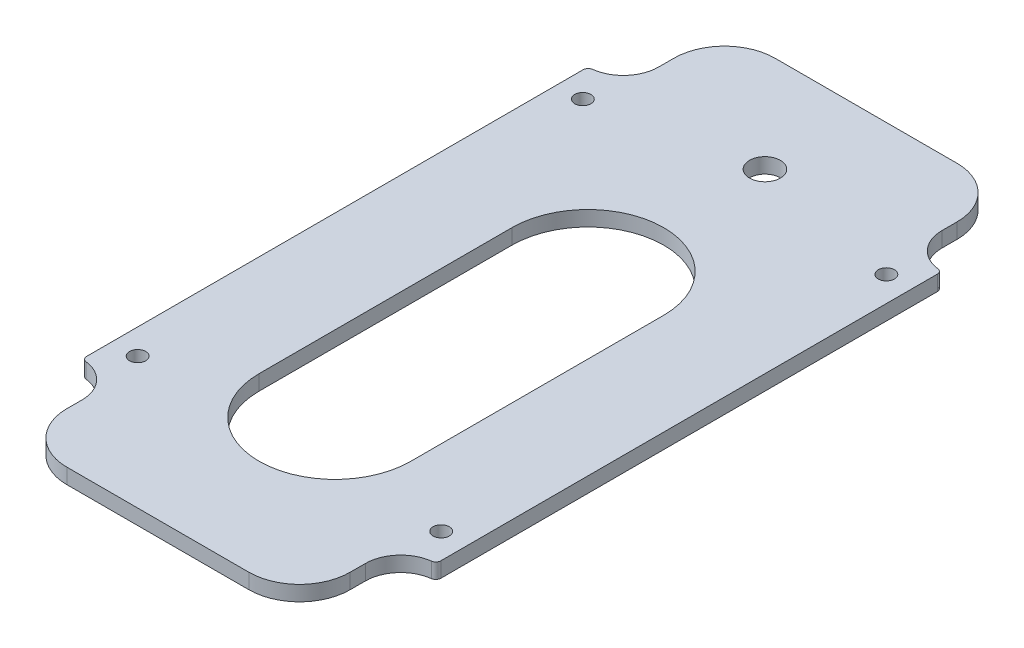
ISO-10303-21;
HEADER;
FILE_DESCRIPTION(('STEP AP214'),'2;1');
FILE_NAME('part.step','',(''),(''),'','','');
FILE_SCHEMA(('AUTOMOTIVE_DESIGN { 1 0 10303 214 1 1 1 1 }'));
ENDSEC;
DATA;
#1=APPLICATION_CONTEXT('core data for automotive mechanical design processes');
#2=APPLICATION_PROTOCOL_DEFINITION('international standard','automotive_design',2000,#1);
#3=PRODUCT_CONTEXT('',#1,'mechanical');
#4=PRODUCT('Part','Part','',(#3));
#5=PRODUCT_RELATED_PRODUCT_CATEGORY('part','',(#4));
#6=PRODUCT_DEFINITION_FORMATION('','',#4);
#7=PRODUCT_DEFINITION_CONTEXT('part definition',#1,'design');
#8=PRODUCT_DEFINITION('design','',#6,#7);
#9=PRODUCT_DEFINITION_SHAPE('','',#8);
#10=(LENGTH_UNIT() NAMED_UNIT(*) SI_UNIT(.MILLI.,.METRE.));
#11=(NAMED_UNIT(*) PLANE_ANGLE_UNIT() SI_UNIT($,.RADIAN.));
#12=(NAMED_UNIT(*) SI_UNIT($,.STERADIAN.) SOLID_ANGLE_UNIT());
#13=UNCERTAINTY_MEASURE_WITH_UNIT(LENGTH_MEASURE(1.E-05),#10,'distance_accuracy_value','');
#14=(GEOMETRIC_REPRESENTATION_CONTEXT(3) GLOBAL_UNCERTAINTY_ASSIGNED_CONTEXT((#13)) GLOBAL_UNIT_ASSIGNED_CONTEXT((#10,
#11,#12)) REPRESENTATION_CONTEXT('',''));
#15=CARTESIAN_POINT('',(0.,0.,0.));
#16=DIRECTION('',(0.,0.,1.));
#17=DIRECTION('',(1.,0.,0.));
#18=AXIS2_PLACEMENT_3D('',#15,#16,#17);
#19=CARTESIAN_POINT('',(0.,3.,0.));
#20=DIRECTION('',(0.,1.,0.));
#21=DIRECTION('',(0.,0.,1.));
#22=AXIS2_PLACEMENT_3D('',#19,#20,#21);
#23=PLANE('',#22);
#24=CARTESIAN_POINT('',(0.,3.,-15.));
#25=DIRECTION('',(0.,1.,0.));
#26=DIRECTION('',(0.,0.,1.));
#27=AXIS2_PLACEMENT_3D('',#24,#25,#26);
#28=CIRCLE('',#27,15.);
#29=CARTESIAN_POINT('',(15.,3.,-15.));
#30=VERTEX_POINT('',#29);
#31=CARTESIAN_POINT('',(-15.,3.,-15.));
#32=VERTEX_POINT('',#31);
#33=EDGE_CURVE('E55',#30,#32,#28,.T.);
#34=ORIENTED_EDGE('',*,*,#33,.F.);
#35=DIRECTION('',(0.,0.,-1.));
#36=VECTOR('',#35,1.);
#37=CARTESIAN_POINT('',(15.,3.,-15.));
#38=LINE('',#37,#36);
#39=CARTESIAN_POINT('',(15.,3.,35.));
#40=VERTEX_POINT('',#39);
#41=EDGE_CURVE('E221',#40,#30,#38,.T.);
#42=ORIENTED_EDGE('',*,*,#41,.F.);
#43=CARTESIAN_POINT('',(0.,3.,35.));
#44=DIRECTION('',(0.,1.,0.));
#45=DIRECTION('',(0.,0.,1.));
#46=AXIS2_PLACEMENT_3D('',#43,#44,#45);
#47=CIRCLE('',#46,15.);
#48=CARTESIAN_POINT('',(-15.,3.,35.));
#49=VERTEX_POINT('',#48);
#50=EDGE_CURVE('E204',#49,#40,#47,.T.);
#51=ORIENTED_EDGE('',*,*,#50,.F.);
#52=DIRECTION('',(0.,0.,1.));
#53=VECTOR('',#52,1.);
#54=CARTESIAN_POINT('',(-15.,3.,-15.));
#55=LINE('',#54,#53);
#56=EDGE_CURVE('E214',#32,#49,#55,.T.);
#57=ORIENTED_EDGE('',*,*,#56,.F.);
#58=EDGE_LOOP('',(#34,#42,#51,#57));
#59=FACE_BOUND('',#58,.T.);
#60=CARTESIAN_POINT('',(0.,3.,-50.));
#61=DIRECTION('',(0.,1.,0.));
#62=DIRECTION('',(0.,0.,1.));
#63=AXIS2_PLACEMENT_3D('',#60,#61,#62);
#64=CIRCLE('',#63,3.048);
#65=CARTESIAN_POINT('',(0.,3.,-46.952));
#66=VERTEX_POINT('',#65);
#67=EDGE_CURVE('E236',#66,#66,#64,.T.);
#68=ORIENTED_EDGE('',*,*,#67,.F.);
#69=EDGE_LOOP('',(#68));
#70=FACE_BOUND('',#69,.T.);
#71=CARTESIAN_POINT('',(30.,3.,44.));
#72=DIRECTION('',(0.,1.,0.));
#73=DIRECTION('',(0.,0.,1.));
#74=AXIS2_PLACEMENT_3D('',#71,#72,#73);
#75=CIRCLE('',#74,1.6);
#76=CARTESIAN_POINT('',(30.,3.,45.6));
#77=VERTEX_POINT('',#76);
#78=EDGE_CURVE('E265',#77,#77,#75,.T.);
#79=ORIENTED_EDGE('',*,*,#78,.F.);
#80=EDGE_LOOP('',(#79));
#81=FACE_BOUND('',#80,.T.);
#82=CARTESIAN_POINT('',(-30.,3.,-44.));
#83=DIRECTION('',(0.,1.,0.));
#84=DIRECTION('',(0.,0.,1.));
#85=AXIS2_PLACEMENT_3D('',#82,#83,#84);
#86=CIRCLE('',#85,1.6);
#87=CARTESIAN_POINT('',(-30.,3.,-42.4));
#88=VERTEX_POINT('',#87);
#89=EDGE_CURVE('E281',#88,#88,#86,.T.);
#90=ORIENTED_EDGE('',*,*,#89,.F.);
#91=EDGE_LOOP('',(#90));
#92=FACE_BOUND('',#91,.T.);
#93=CARTESIAN_POINT('',(30.,3.,-44.));
#94=DIRECTION('',(0.,1.,0.));
#95=DIRECTION('',(0.,0.,1.));
#96=AXIS2_PLACEMENT_3D('',#93,#94,#95);
#97=CIRCLE('',#96,1.6);
#98=CARTESIAN_POINT('',(30.,3.,-42.4));
#99=VERTEX_POINT('',#98);
#100=EDGE_CURVE('E273',#99,#99,#97,.T.);
#101=ORIENTED_EDGE('',*,*,#100,.F.);
#102=EDGE_LOOP('',(#101));
#103=FACE_BOUND('',#102,.T.);
#104=CARTESIAN_POINT('',(-30.,3.,44.));
#105=DIRECTION('',(0.,1.,0.));
#106=DIRECTION('',(0.,0.,1.));
#107=AXIS2_PLACEMENT_3D('',#104,#105,#106);
#108=CIRCLE('',#107,1.6);
#109=CARTESIAN_POINT('',(-30.,3.,45.6));
#110=VERTEX_POINT('',#109);
#111=EDGE_CURVE('E257',#110,#110,#108,.T.);
#112=ORIENTED_EDGE('',*,*,#111,.F.);
#113=EDGE_LOOP('',(#112));
#114=FACE_BOUND('',#113,.T.);
#115=DIRECTION('',(1.,0.,0.));
#116=VECTOR('',#115,1.);
#117=CARTESIAN_POINT('',(-28.,3.,-70.));
#118=LINE('',#117,#116);
#119=CARTESIAN_POINT('',(-18.,3.,-70.));
#120=VERTEX_POINT('',#119);
#121=CARTESIAN_POINT('',(18.,3.,-70.));
#122=VERTEX_POINT('',#121);
#123=EDGE_CURVE('E248',#120,#122,#118,.T.);
#124=ORIENTED_EDGE('',*,*,#123,.F.);
#125=CARTESIAN_POINT('',(-18.,3.,-60.));
#126=DIRECTION('',(0.,1.,0.));
#127=DIRECTION('',(0.,0.,1.));
#128=AXIS2_PLACEMENT_3D('',#125,#126,#127);
#129=CIRCLE('',#128,10.);
#130=CARTESIAN_POINT('',(-28.,3.,-60.));
#131=VERTEX_POINT('',#130);
#132=EDGE_CURVE('E461',#120,#131,#129,.T.);
#133=ORIENTED_EDGE('',*,*,#132,.T.);
#134=DIRECTION('',(0.,0.,1.));
#135=VECTOR('',#134,1.);
#136=CARTESIAN_POINT('',(-28.,3.,-132.));
#137=LINE('',#136,#135);
#138=CARTESIAN_POINT('',(-28.,3.,-57.));
#139=VERTEX_POINT('',#138);
#140=EDGE_CURVE('E293',#131,#139,#137,.T.);
#141=ORIENTED_EDGE('',*,*,#140,.T.);
#142=CARTESIAN_POINT('',(-35.,3.,-57.));
#143=DIRECTION('',(0.,1.,0.));
#144=DIRECTION('',(0.,0.,1.));
#145=AXIS2_PLACEMENT_3D('',#142,#143,#144);
#146=CIRCLE('',#145,7.);
#147=CARTESIAN_POINT('',(-34.125,3.,-50.0549028084555));
#148=VERTEX_POINT('',#147);
#149=EDGE_CURVE('E374',#139,#148,#146,.F.);
#150=ORIENTED_EDGE('',*,*,#149,.T.);
#151=CARTESIAN_POINT('',(-34.,3.,-49.0627460668062));
#152=DIRECTION('',(0.,1.,0.));
#153=DIRECTION('',(0.,0.,1.));
#154=AXIS2_PLACEMENT_3D('',#151,#152,#153);
#155=CIRCLE('',#154,1.);
#156=CARTESIAN_POINT('',(-35.,3.,-49.0627460668062));
#157=VERTEX_POINT('',#156);
#158=EDGE_CURVE('E401',#148,#157,#155,.T.);
#159=ORIENTED_EDGE('',*,*,#158,.T.);
#160=DIRECTION('',(0.,0.,1.));
#161=VECTOR('',#160,1.);
#162=CARTESIAN_POINT('',(-35.,3.,50.));
#163=LINE('',#162,#161);
#164=CARTESIAN_POINT('',(-35.,3.,49.0627460668062));
#165=VERTEX_POINT('',#164);
#166=EDGE_CURVE('E297',#157,#165,#163,.T.);
#167=ORIENTED_EDGE('',*,*,#166,.T.);
#168=CARTESIAN_POINT('',(-34.,3.,49.0627460668062));
#169=DIRECTION('',(0.,1.,0.));
#170=DIRECTION('',(0.,0.,1.));
#171=AXIS2_PLACEMENT_3D('',#168,#169,#170);
#172=CIRCLE('',#171,1.);
#173=CARTESIAN_POINT('',(-34.125,3.,50.0549028084554));
#174=VERTEX_POINT('',#173);
#175=EDGE_CURVE('E404',#165,#174,#172,.T.);
#176=ORIENTED_EDGE('',*,*,#175,.T.);
#177=CARTESIAN_POINT('',(-35.,3.,57.));
#178=DIRECTION('',(0.,1.,0.));
#179=DIRECTION('',(0.,0.,1.));
#180=AXIS2_PLACEMENT_3D('',#177,#178,#179);
#181=CIRCLE('',#180,7.);
#182=CARTESIAN_POINT('',(-28.,3.,57.));
#183=VERTEX_POINT('',#182);
#184=EDGE_CURVE('E352',#174,#183,#181,.F.);
#185=ORIENTED_EDGE('',*,*,#184,.T.);
#186=DIRECTION('',(0.,0.,1.));
#187=VECTOR('',#186,1.);
#188=CARTESIAN_POINT('',(-28.,3.,132.));
#189=LINE('',#188,#187);
#190=CARTESIAN_POINT('',(-28.,3.,60.));
#191=VERTEX_POINT('',#190);
#192=EDGE_CURVE('E301',#183,#191,#189,.T.);
#193=ORIENTED_EDGE('',*,*,#192,.T.);
#194=CARTESIAN_POINT('',(-18.,3.,60.));
#195=DIRECTION('',(0.,1.,0.));
#196=DIRECTION('',(0.,0.,1.));
#197=AXIS2_PLACEMENT_3D('',#194,#195,#196);
#198=CIRCLE('',#197,10.);
#199=CARTESIAN_POINT('',(-18.,3.,70.));
#200=VERTEX_POINT('',#199);
#201=EDGE_CURVE('E452',#191,#200,#198,.T.);
#202=ORIENTED_EDGE('',*,*,#201,.T.);
#203=DIRECTION('',(1.,0.,0.));
#204=VECTOR('',#203,1.);
#205=CARTESIAN_POINT('',(-28.,3.,70.));
#206=LINE('',#205,#204);
#207=CARTESIAN_POINT('',(18.,3.,70.));
#208=VERTEX_POINT('',#207);
#209=EDGE_CURVE('E240',#200,#208,#206,.T.);
#210=ORIENTED_EDGE('',*,*,#209,.T.);
#211=CARTESIAN_POINT('',(18.,3.,60.));
#212=DIRECTION('',(0.,1.,0.));
#213=DIRECTION('',(0.,0.,1.));
#214=AXIS2_PLACEMENT_3D('',#211,#212,#213);
#215=CIRCLE('',#214,10.);
#216=CARTESIAN_POINT('',(28.,3.,60.));
#217=VERTEX_POINT('',#216);
#218=EDGE_CURVE('E455',#208,#217,#215,.T.);
#219=ORIENTED_EDGE('',*,*,#218,.T.);
#220=DIRECTION('',(0.,0.,-1.));
#221=VECTOR('',#220,1.);
#222=CARTESIAN_POINT('',(28.,3.,132.));
#223=LINE('',#222,#221);
#224=CARTESIAN_POINT('',(28.,3.,57.));
#225=VERTEX_POINT('',#224);
#226=EDGE_CURVE('E305',#217,#225,#223,.T.);
#227=ORIENTED_EDGE('',*,*,#226,.T.);
#228=CARTESIAN_POINT('',(35.,3.,57.));
#229=DIRECTION('',(0.,1.,0.));
#230=DIRECTION('',(0.,0.,1.));
#231=AXIS2_PLACEMENT_3D('',#228,#229,#230);
#232=CIRCLE('',#231,7.);
#233=CARTESIAN_POINT('',(34.125,3.,50.0549028084555));
#234=VERTEX_POINT('',#233);
#235=EDGE_CURVE('E359',#225,#234,#232,.F.);
#236=ORIENTED_EDGE('',*,*,#235,.T.);
#237=CARTESIAN_POINT('',(34.,3.,49.0627460668062));
#238=DIRECTION('',(0.,1.,0.));
#239=DIRECTION('',(0.,0.,1.));
#240=AXIS2_PLACEMENT_3D('',#237,#238,#239);
#241=CIRCLE('',#240,1.);
#242=CARTESIAN_POINT('',(35.,3.,49.0627460668062));
#243=VERTEX_POINT('',#242);
#244=EDGE_CURVE('E407',#234,#243,#241,.T.);
#245=ORIENTED_EDGE('',*,*,#244,.T.);
#246=DIRECTION('',(0.,0.,-1.));
#247=VECTOR('',#246,1.);
#248=CARTESIAN_POINT('',(35.,3.,50.));
#249=LINE('',#248,#247);
#250=CARTESIAN_POINT('',(35.,3.,-49.0627460668062));
#251=VERTEX_POINT('',#250);
#252=EDGE_CURVE('E308',#243,#251,#249,.T.);
#253=ORIENTED_EDGE('',*,*,#252,.T.);
#254=CARTESIAN_POINT('',(34.,3.,-49.0627460668062));
#255=DIRECTION('',(0.,1.,0.));
#256=DIRECTION('',(0.,0.,1.));
#257=AXIS2_PLACEMENT_3D('',#254,#255,#256);
#258=CIRCLE('',#257,1.);
#259=CARTESIAN_POINT('',(34.125,3.,-50.0549028084554));
#260=VERTEX_POINT('',#259);
#261=EDGE_CURVE('E410',#251,#260,#258,.T.);
#262=ORIENTED_EDGE('',*,*,#261,.T.);
#263=CARTESIAN_POINT('',(35.,3.,-57.));
#264=DIRECTION('',(0.,1.,0.));
#265=DIRECTION('',(0.,0.,1.));
#266=AXIS2_PLACEMENT_3D('',#263,#264,#265);
#267=CIRCLE('',#266,7.);
#268=CARTESIAN_POINT('',(28.,3.,-57.));
#269=VERTEX_POINT('',#268);
#270=EDGE_CURVE('E367',#260,#269,#267,.F.);
#271=ORIENTED_EDGE('',*,*,#270,.T.);
#272=DIRECTION('',(0.,0.,-1.));
#273=VECTOR('',#272,1.);
#274=CARTESIAN_POINT('',(28.,3.,-132.));
#275=LINE('',#274,#273);
#276=CARTESIAN_POINT('',(28.,3.,-60.));
#277=VERTEX_POINT('',#276);
#278=EDGE_CURVE('E289',#269,#277,#275,.T.);
#279=ORIENTED_EDGE('',*,*,#278,.T.);
#280=CARTESIAN_POINT('',(18.,3.,-60.));
#281=DIRECTION('',(0.,1.,0.));
#282=DIRECTION('',(0.,0.,1.));
#283=AXIS2_PLACEMENT_3D('',#280,#281,#282);
#284=CIRCLE('',#283,10.);
#285=EDGE_CURVE('E458',#277,#122,#284,.T.);
#286=ORIENTED_EDGE('',*,*,#285,.T.);
#287=EDGE_LOOP('',(#124,#133,#141,#150,#159,#167,#176,#185,#193,#202,#210,#219,#227,#236,#245,
#253,#262,#271,#279,#286));
#288=FACE_BOUND('',#287,.T.);
#289=ADVANCED_FACE('F39',(#59,#70,#81,#92,#103,#114,#288),#23,.T.);
#290=CARTESIAN_POINT('',(0.,0.,0.));
#291=DIRECTION('',(0.,1.,0.));
#292=DIRECTION('',(0.,0.,1.));
#293=AXIS2_PLACEMENT_3D('',#290,#291,#292);
#294=PLANE('',#293);
#295=DIRECTION('',(0.,0.,-1.));
#296=VECTOR('',#295,1.);
#297=CARTESIAN_POINT('',(15.,0.,0.));
#298=LINE('',#297,#296);
#299=CARTESIAN_POINT('',(15.,0.,35.));
#300=VERTEX_POINT('',#299);
#301=CARTESIAN_POINT('',(15.,0.,-15.));
#302=VERTEX_POINT('',#301);
#303=EDGE_CURVE('E48',#300,#302,#298,.T.);
#304=ORIENTED_EDGE('',*,*,#303,.T.);
#305=CARTESIAN_POINT('',(0.,0.,-15.));
#306=DIRECTION('',(0.,1.,0.));
#307=DIRECTION('',(0.,0.,1.));
#308=AXIS2_PLACEMENT_3D('',#305,#306,#307);
#309=CIRCLE('',#308,15.);
#310=CARTESIAN_POINT('',(-15.,0.,-15.));
#311=VERTEX_POINT('',#310);
#312=EDGE_CURVE('E11',#302,#311,#309,.T.);
#313=ORIENTED_EDGE('',*,*,#312,.T.);
#314=DIRECTION('',(0.,0.,1.));
#315=VECTOR('',#314,1.);
#316=CARTESIAN_POINT('',(-15.,0.,0.));
#317=LINE('',#316,#315);
#318=CARTESIAN_POINT('',(-15.,0.,35.));
#319=VERTEX_POINT('',#318);
#320=EDGE_CURVE('E482',#311,#319,#317,.T.);
#321=ORIENTED_EDGE('',*,*,#320,.T.);
#322=CARTESIAN_POINT('',(0.,0.,35.));
#323=DIRECTION('',(0.,1.,0.));
#324=DIRECTION('',(0.,0.,1.));
#325=AXIS2_PLACEMENT_3D('',#322,#323,#324);
#326=CIRCLE('',#325,15.);
#327=EDGE_CURVE('E207',#319,#300,#326,.T.);
#328=ORIENTED_EDGE('',*,*,#327,.T.);
#329=EDGE_LOOP('',(#304,#313,#321,#328));
#330=FACE_BOUND('',#329,.T.);
#331=CARTESIAN_POINT('',(0.,0.,-50.));
#332=DIRECTION('',(0.,1.,0.));
#333=DIRECTION('',(0.,0.,1.));
#334=AXIS2_PLACEMENT_3D('',#331,#332,#333);
#335=CIRCLE('',#334,3.048);
#336=CARTESIAN_POINT('',(0.,0.,-46.952));
#337=VERTEX_POINT('',#336);
#338=EDGE_CURVE('E231',#337,#337,#335,.T.);
#339=ORIENTED_EDGE('',*,*,#338,.T.);
#340=EDGE_LOOP('',(#339));
#341=FACE_BOUND('',#340,.T.);
#342=CARTESIAN_POINT('',(-30.,0.,44.));
#343=DIRECTION('',(0.,1.,0.));
#344=DIRECTION('',(0.,0.,1.));
#345=AXIS2_PLACEMENT_3D('',#342,#343,#344);
#346=CIRCLE('',#345,1.6);
#347=CARTESIAN_POINT('',(-30.,0.,45.6));
#348=VERTEX_POINT('',#347);
#349=EDGE_CURVE('E256',#348,#348,#346,.T.);
#350=ORIENTED_EDGE('',*,*,#349,.T.);
#351=EDGE_LOOP('',(#350));
#352=FACE_BOUND('',#351,.T.);
#353=CARTESIAN_POINT('',(30.,0.,44.));
#354=DIRECTION('',(0.,1.,0.));
#355=DIRECTION('',(0.,0.,1.));
#356=AXIS2_PLACEMENT_3D('',#353,#354,#355);
#357=CIRCLE('',#356,1.6);
#358=CARTESIAN_POINT('',(30.,0.,45.6));
#359=VERTEX_POINT('',#358);
#360=EDGE_CURVE('E261',#359,#359,#357,.T.);
#361=ORIENTED_EDGE('',*,*,#360,.T.);
#362=EDGE_LOOP('',(#361));
#363=FACE_BOUND('',#362,.T.);
#364=CARTESIAN_POINT('',(30.,0.,-44.));
#365=DIRECTION('',(0.,1.,0.));
#366=DIRECTION('',(0.,0.,1.));
#367=AXIS2_PLACEMENT_3D('',#364,#365,#366);
#368=CIRCLE('',#367,1.6);
#369=CARTESIAN_POINT('',(30.,0.,-42.4));
#370=VERTEX_POINT('',#369);
#371=EDGE_CURVE('E269',#370,#370,#368,.T.);
#372=ORIENTED_EDGE('',*,*,#371,.T.);
#373=EDGE_LOOP('',(#372));
#374=FACE_BOUND('',#373,.T.);
#375=CARTESIAN_POINT('',(-30.,0.,-44.));
#376=DIRECTION('',(0.,1.,0.));
#377=DIRECTION('',(0.,0.,1.));
#378=AXIS2_PLACEMENT_3D('',#375,#376,#377);
#379=CIRCLE('',#378,1.6);
#380=CARTESIAN_POINT('',(-30.,0.,-42.4));
#381=VERTEX_POINT('',#380);
#382=EDGE_CURVE('E277',#381,#381,#379,.T.);
#383=ORIENTED_EDGE('',*,*,#382,.T.);
#384=EDGE_LOOP('',(#383));
#385=FACE_BOUND('',#384,.T.);
#386=DIRECTION('',(0.,0.,1.));
#387=VECTOR('',#386,1.);
#388=CARTESIAN_POINT('',(-28.,0.,-132.));
#389=LINE('',#388,#387);
#390=CARTESIAN_POINT('',(-28.,0.,-60.));
#391=VERTEX_POINT('',#390);
#392=CARTESIAN_POINT('',(-28.,0.,-57.));
#393=VERTEX_POINT('',#392);
#394=EDGE_CURVE('E316',#391,#393,#389,.T.);
#395=ORIENTED_EDGE('',*,*,#394,.F.);
#396=CARTESIAN_POINT('',(-18.,0.,-60.));
#397=DIRECTION('',(0.,1.,0.));
#398=DIRECTION('',(0.,0.,1.));
#399=AXIS2_PLACEMENT_3D('',#396,#397,#398);
#400=CIRCLE('',#399,10.);
#401=CARTESIAN_POINT('',(-18.,0.,-70.));
#402=VERTEX_POINT('',#401);
#403=EDGE_CURVE('E443',#391,#402,#400,.F.);
#404=ORIENTED_EDGE('',*,*,#403,.T.);
#405=DIRECTION('',(1.,0.,0.));
#406=VECTOR('',#405,1.);
#407=CARTESIAN_POINT('',(0.,0.,-70.));
#408=LINE('',#407,#406);
#409=CARTESIAN_POINT('',(18.,0.,-70.));
#410=VERTEX_POINT('',#409);
#411=EDGE_CURVE('E252',#402,#410,#408,.T.);
#412=ORIENTED_EDGE('',*,*,#411,.T.);
#413=CARTESIAN_POINT('',(18.,0.,-60.));
#414=DIRECTION('',(0.,1.,0.));
#415=DIRECTION('',(0.,0.,1.));
#416=AXIS2_PLACEMENT_3D('',#413,#414,#415);
#417=CIRCLE('',#416,10.);
#418=CARTESIAN_POINT('',(28.,0.,-60.));
#419=VERTEX_POINT('',#418);
#420=EDGE_CURVE('E440',#410,#419,#417,.F.);
#421=ORIENTED_EDGE('',*,*,#420,.T.);
#422=DIRECTION('',(0.,0.,-1.));
#423=VECTOR('',#422,1.);
#424=CARTESIAN_POINT('',(28.,0.,-132.));
#425=LINE('',#424,#423);
#426=CARTESIAN_POINT('',(28.,0.,-57.));
#427=VERTEX_POINT('',#426);
#428=EDGE_CURVE('E285',#427,#419,#425,.T.);
#429=ORIENTED_EDGE('',*,*,#428,.F.);
#430=CARTESIAN_POINT('',(35.,0.,-57.));
#431=DIRECTION('',(0.,1.,0.));
#432=DIRECTION('',(0.,0.,1.));
#433=AXIS2_PLACEMENT_3D('',#430,#431,#432);
#434=CIRCLE('',#433,7.);
#435=CARTESIAN_POINT('',(34.125,0.,-50.0549028084554));
#436=VERTEX_POINT('',#435);
#437=EDGE_CURVE('E363',#427,#436,#434,.T.);
#438=ORIENTED_EDGE('',*,*,#437,.T.);
#439=CARTESIAN_POINT('',(34.,0.,-49.0627460668062));
#440=DIRECTION('',(0.,1.,0.));
#441=DIRECTION('',(0.,0.,1.));
#442=AXIS2_PLACEMENT_3D('',#439,#440,#441);
#443=CIRCLE('',#442,1.);
#444=CARTESIAN_POINT('',(35.,0.,-49.0627460668062));
#445=VERTEX_POINT('',#444);
#446=EDGE_CURVE('E391',#436,#445,#443,.F.);
#447=ORIENTED_EDGE('',*,*,#446,.T.);
#448=DIRECTION('',(0.,0.,-1.));
#449=VECTOR('',#448,1.);
#450=CARTESIAN_POINT('',(35.,0.,50.));
#451=LINE('',#450,#449);
#452=CARTESIAN_POINT('',(35.,0.,49.0627460668062));
#453=VERTEX_POINT('',#452);
#454=EDGE_CURVE('E294',#453,#445,#451,.T.);
#455=ORIENTED_EDGE('',*,*,#454,.F.);
#456=CARTESIAN_POINT('',(34.,0.,49.0627460668062));
#457=DIRECTION('',(0.,1.,0.));
#458=DIRECTION('',(0.,0.,1.));
#459=AXIS2_PLACEMENT_3D('',#456,#457,#458);
#460=CIRCLE('',#459,1.);
#461=CARTESIAN_POINT('',(34.125,0.,50.0549028084555));
#462=VERTEX_POINT('',#461);
#463=EDGE_CURVE('E388',#453,#462,#460,.F.);
#464=ORIENTED_EDGE('',*,*,#463,.T.);
#465=CARTESIAN_POINT('',(35.,0.,57.));
#466=DIRECTION('',(0.,1.,0.));
#467=DIRECTION('',(0.,0.,1.));
#468=AXIS2_PLACEMENT_3D('',#465,#466,#467);
#469=CIRCLE('',#468,7.);
#470=CARTESIAN_POINT('',(28.,0.,57.));
#471=VERTEX_POINT('',#470);
#472=EDGE_CURVE('E355',#462,#471,#469,.T.);
#473=ORIENTED_EDGE('',*,*,#472,.T.);
#474=DIRECTION('',(0.,0.,-1.));
#475=VECTOR('',#474,1.);
#476=CARTESIAN_POINT('',(28.,0.,132.));
#477=LINE('',#476,#475);
#478=CARTESIAN_POINT('',(28.,0.,60.));
#479=VERTEX_POINT('',#478);
#480=EDGE_CURVE('E327',#479,#471,#477,.T.);
#481=ORIENTED_EDGE('',*,*,#480,.F.);
#482=CARTESIAN_POINT('',(18.,0.,60.));
#483=DIRECTION('',(0.,1.,0.));
#484=DIRECTION('',(0.,0.,1.));
#485=AXIS2_PLACEMENT_3D('',#482,#483,#484);
#486=CIRCLE('',#485,10.);
#487=CARTESIAN_POINT('',(18.,0.,70.));
#488=VERTEX_POINT('',#487);
#489=EDGE_CURVE('E437',#479,#488,#486,.F.);
#490=ORIENTED_EDGE('',*,*,#489,.T.);
#491=DIRECTION('',(1.,0.,0.));
#492=VECTOR('',#491,1.);
#493=CARTESIAN_POINT('',(0.,0.,70.));
#494=LINE('',#493,#492);
#495=CARTESIAN_POINT('',(-18.,0.,70.));
#496=VERTEX_POINT('',#495);
#497=EDGE_CURVE('E244',#496,#488,#494,.T.);
#498=ORIENTED_EDGE('',*,*,#497,.F.);
#499=CARTESIAN_POINT('',(-18.,0.,60.));
#500=DIRECTION('',(0.,1.,0.));
#501=DIRECTION('',(0.,0.,1.));
#502=AXIS2_PLACEMENT_3D('',#499,#500,#501);
#503=CIRCLE('',#502,10.);
#504=CARTESIAN_POINT('',(-28.,0.,60.));
#505=VERTEX_POINT('',#504);
#506=EDGE_CURVE('E434',#496,#505,#503,.F.);
#507=ORIENTED_EDGE('',*,*,#506,.T.);
#508=DIRECTION('',(0.,0.,1.));
#509=VECTOR('',#508,1.);
#510=CARTESIAN_POINT('',(-28.,0.,132.));
#511=LINE('',#510,#509);
#512=CARTESIAN_POINT('',(-28.,0.,57.));
#513=VERTEX_POINT('',#512);
#514=EDGE_CURVE('E323',#513,#505,#511,.T.);
#515=ORIENTED_EDGE('',*,*,#514,.F.);
#516=CARTESIAN_POINT('',(-35.,0.,57.));
#517=DIRECTION('',(0.,1.,0.));
#518=DIRECTION('',(0.,0.,1.));
#519=AXIS2_PLACEMENT_3D('',#516,#517,#518);
#520=CIRCLE('',#519,7.);
#521=CARTESIAN_POINT('',(-34.125,0.,50.0549028084554));
#522=VERTEX_POINT('',#521);
#523=EDGE_CURVE('E348',#513,#522,#520,.T.);
#524=ORIENTED_EDGE('',*,*,#523,.T.);
#525=CARTESIAN_POINT('',(-34.,0.,49.0627460668062));
#526=DIRECTION('',(0.,1.,0.));
#527=DIRECTION('',(0.,0.,1.));
#528=AXIS2_PLACEMENT_3D('',#525,#526,#527);
#529=CIRCLE('',#528,1.);
#530=CARTESIAN_POINT('',(-35.,0.,49.0627460668062));
#531=VERTEX_POINT('',#530);
#532=EDGE_CURVE('E385',#522,#531,#529,.F.);
#533=ORIENTED_EDGE('',*,*,#532,.T.);
#534=DIRECTION('',(0.,0.,1.));
#535=VECTOR('',#534,1.);
#536=CARTESIAN_POINT('',(-35.,0.,50.));
#537=LINE('',#536,#535);
#538=CARTESIAN_POINT('',(-35.,0.,-49.0627460668062));
#539=VERTEX_POINT('',#538);
#540=EDGE_CURVE('E319',#539,#531,#537,.T.);
#541=ORIENTED_EDGE('',*,*,#540,.F.);
#542=CARTESIAN_POINT('',(-34.,0.,-49.0627460668062));
#543=DIRECTION('',(0.,1.,0.));
#544=DIRECTION('',(0.,0.,1.));
#545=AXIS2_PLACEMENT_3D('',#542,#543,#544);
#546=CIRCLE('',#545,1.);
#547=CARTESIAN_POINT('',(-34.125,0.,-50.0549028084555));
#548=VERTEX_POINT('',#547);
#549=EDGE_CURVE('E382',#539,#548,#546,.F.);
#550=ORIENTED_EDGE('',*,*,#549,.T.);
#551=CARTESIAN_POINT('',(-35.,0.,-57.));
#552=DIRECTION('',(0.,1.,0.));
#553=DIRECTION('',(0.,0.,1.));
#554=AXIS2_PLACEMENT_3D('',#551,#552,#553);
#555=CIRCLE('',#554,7.);
#556=EDGE_CURVE('E370',#548,#393,#555,.T.);
#557=ORIENTED_EDGE('',*,*,#556,.T.);
#558=EDGE_LOOP('',(#395,#404,#412,#421,#429,#438,#447,#455,#464,#473,#481,#490,#498,#507,#515,
#524,#533,#541,#550,#557));
#559=FACE_BOUND('',#558,.T.);
#560=ADVANCED_FACE('F492',(#330,#341,#352,#363,#374,#385,#559),#294,.F.);
#561=CARTESIAN_POINT('',(-28.,3.,132.));
#562=DIRECTION('',(1.,0.,0.));
#563=DIRECTION('',(0.,0.,-1.));
#564=AXIS2_PLACEMENT_3D('',#561,#562,#563);
#565=PLANE('',#564);
#566=ORIENTED_EDGE('',*,*,#514,.T.);
#567=DIRECTION('',(0.,1.,0.));
#568=VECTOR('',#567,1.);
#569=CARTESIAN_POINT('',(-28.,3.,60.));
#570=LINE('',#569,#568);
#571=EDGE_CURVE('E478',#505,#191,#570,.T.);
#572=ORIENTED_EDGE('',*,*,#571,.T.);
#573=ORIENTED_EDGE('',*,*,#192,.F.);
#574=DIRECTION('',(0.,-1.,0.));
#575=VECTOR('',#574,1.);
#576=CARTESIAN_POINT('',(-28.,0.,57.));
#577=LINE('',#576,#575);
#578=EDGE_CURVE('E312',#183,#513,#577,.T.);
#579=ORIENTED_EDGE('',*,*,#578,.T.);
#580=EDGE_LOOP('',(#566,#572,#573,#579));
#581=FACE_BOUND('',#580,.T.);
#582=ADVANCED_FACE('F514',(#581),#565,.F.);
#583=CARTESIAN_POINT('',(28.,3.,132.));
#584=DIRECTION('',(-1.,0.,0.));
#585=DIRECTION('',(0.,0.,1.));
#586=AXIS2_PLACEMENT_3D('',#583,#584,#585);
#587=PLANE('',#586);
#588=ORIENTED_EDGE('',*,*,#226,.F.);
#589=DIRECTION('',(0.,1.,0.));
#590=VECTOR('',#589,1.);
#591=CARTESIAN_POINT('',(28.,0.,60.));
#592=LINE('',#591,#590);
#593=EDGE_CURVE('E475',#217,#479,#592,.F.);
#594=ORIENTED_EDGE('',*,*,#593,.T.);
#595=ORIENTED_EDGE('',*,*,#480,.T.);
#596=DIRECTION('',(0.,-1.,0.));
#597=VECTOR('',#596,1.);
#598=CARTESIAN_POINT('',(28.,3.,57.));
#599=LINE('',#598,#597);
#600=EDGE_CURVE('E336',#471,#225,#599,.F.);
#601=ORIENTED_EDGE('',*,*,#600,.T.);
#602=EDGE_LOOP('',(#588,#594,#595,#601));
#603=FACE_BOUND('',#602,.T.);
#604=ADVANCED_FACE('F525',(#603),#587,.F.);
#605=CARTESIAN_POINT('',(28.,3.,-132.));
#606=DIRECTION('',(-1.,0.,0.));
#607=DIRECTION('',(0.,0.,1.));
#608=AXIS2_PLACEMENT_3D('',#605,#606,#607);
#609=PLANE('',#608);
#610=ORIENTED_EDGE('',*,*,#428,.T.);
#611=DIRECTION('',(0.,1.,0.));
#612=VECTOR('',#611,1.);
#613=CARTESIAN_POINT('',(28.,3.,-60.));
#614=LINE('',#613,#612);
#615=EDGE_CURVE('E464',#419,#277,#614,.T.);
#616=ORIENTED_EDGE('',*,*,#615,.T.);
#617=ORIENTED_EDGE('',*,*,#278,.F.);
#618=DIRECTION('',(0.,-1.,0.));
#619=VECTOR('',#618,1.);
#620=CARTESIAN_POINT('',(28.,0.,-57.));
#621=LINE('',#620,#619);
#622=EDGE_CURVE('E340',#269,#427,#621,.T.);
#623=ORIENTED_EDGE('',*,*,#622,.T.);
#624=EDGE_LOOP('',(#610,#616,#617,#623));
#625=FACE_BOUND('',#624,.T.);
#626=ADVANCED_FACE('F528',(#625),#609,.F.);
#627=CARTESIAN_POINT('',(-28.,3.,-132.));
#628=DIRECTION('',(1.,0.,0.));
#629=DIRECTION('',(0.,0.,-1.));
#630=AXIS2_PLACEMENT_3D('',#627,#628,#629);
#631=PLANE('',#630);
#632=ORIENTED_EDGE('',*,*,#140,.F.);
#633=DIRECTION('',(0.,-1.,0.));
#634=VECTOR('',#633,1.);
#635=CARTESIAN_POINT('',(-28.,3.,-60.));
#636=LINE('',#635,#634);
#637=EDGE_CURVE('E430',#131,#391,#636,.T.);
#638=ORIENTED_EDGE('',*,*,#637,.T.);
#639=ORIENTED_EDGE('',*,*,#394,.T.);
#640=DIRECTION('',(0.,-1.,0.));
#641=VECTOR('',#640,1.);
#642=CARTESIAN_POINT('',(-28.,3.,-57.));
#643=LINE('',#642,#641);
#644=EDGE_CURVE('E344',#393,#139,#643,.F.);
#645=ORIENTED_EDGE('',*,*,#644,.T.);
#646=EDGE_LOOP('',(#632,#638,#639,#645));
#647=FACE_BOUND('',#646,.T.);
#648=ADVANCED_FACE('F535',(#647),#631,.F.);
#649=CARTESIAN_POINT('',(-35.,3.,50.));
#650=DIRECTION('',(1.,0.,0.));
#651=DIRECTION('',(0.,0.,-1.));
#652=AXIS2_PLACEMENT_3D('',#649,#650,#651);
#653=PLANE('',#652);
#654=ORIENTED_EDGE('',*,*,#540,.T.);
#655=DIRECTION('',(0.,1.,0.));
#656=VECTOR('',#655,1.);
#657=CARTESIAN_POINT('',(-35.,3.,49.0627460668062));
#658=LINE('',#657,#656);
#659=EDGE_CURVE('E424',#531,#165,#658,.T.);
#660=ORIENTED_EDGE('',*,*,#659,.T.);
#661=ORIENTED_EDGE('',*,*,#166,.F.);
#662=DIRECTION('',(0.,1.,0.));
#663=VECTOR('',#662,1.);
#664=CARTESIAN_POINT('',(-35.,3.,-49.0627460668062));
#665=LINE('',#664,#663);
#666=EDGE_CURVE('E420',#157,#539,#665,.F.);
#667=ORIENTED_EDGE('',*,*,#666,.T.);
#668=EDGE_LOOP('',(#654,#660,#661,#667));
#669=FACE_BOUND('',#668,.T.);
#670=ADVANCED_FACE('F523',(#669),#653,.F.);
#671=CARTESIAN_POINT('',(35.,3.,50.));
#672=DIRECTION('',(-1.,0.,0.));
#673=DIRECTION('',(0.,0.,1.));
#674=AXIS2_PLACEMENT_3D('',#671,#672,#673);
#675=PLANE('',#674);
#676=ORIENTED_EDGE('',*,*,#454,.T.);
#677=DIRECTION('',(0.,1.,0.));
#678=VECTOR('',#677,1.);
#679=CARTESIAN_POINT('',(35.,3.,-49.0627460668062));
#680=LINE('',#679,#678);
#681=EDGE_CURVE('E398',#445,#251,#680,.T.);
#682=ORIENTED_EDGE('',*,*,#681,.T.);
#683=ORIENTED_EDGE('',*,*,#252,.F.);
#684=DIRECTION('',(0.,1.,0.));
#685=VECTOR('',#684,1.);
#686=CARTESIAN_POINT('',(35.,3.,49.0627460668062));
#687=LINE('',#686,#685);
#688=EDGE_CURVE('E394',#243,#453,#687,.F.);
#689=ORIENTED_EDGE('',*,*,#688,.T.);
#690=EDGE_LOOP('',(#676,#682,#683,#689));
#691=FACE_BOUND('',#690,.T.);
#692=ADVANCED_FACE('F520',(#691),#675,.F.);
#693=CARTESIAN_POINT('',(-30.,3.,-44.));
#694=DIRECTION('',(0.,-1.,0.));
#695=DIRECTION('',(0.,0.,-1.));
#696=AXIS2_PLACEMENT_3D('',#693,#694,#695);
#697=CYLINDRICAL_SURFACE('',#696,1.6);
#698=ORIENTED_EDGE('',*,*,#89,.T.);
#699=EDGE_LOOP('',(#698));
#700=FACE_BOUND('',#699,.T.);
#701=ORIENTED_EDGE('',*,*,#382,.F.);
#702=EDGE_LOOP('',(#701));
#703=FACE_BOUND('',#702,.T.);
#704=ADVANCED_FACE('F517',(#700,#703),#697,.F.);
#705=CARTESIAN_POINT('',(30.,3.,-44.));
#706=DIRECTION('',(0.,-1.,0.));
#707=DIRECTION('',(0.,0.,-1.));
#708=AXIS2_PLACEMENT_3D('',#705,#706,#707);
#709=CYLINDRICAL_SURFACE('',#708,1.6);
#710=ORIENTED_EDGE('',*,*,#100,.T.);
#711=EDGE_LOOP('',(#710));
#712=FACE_BOUND('',#711,.T.);
#713=ORIENTED_EDGE('',*,*,#371,.F.);
#714=EDGE_LOOP('',(#713));
#715=FACE_BOUND('',#714,.T.);
#716=ADVANCED_FACE('F658',(#712,#715),#709,.F.);
#717=CARTESIAN_POINT('',(30.,3.,44.));
#718=DIRECTION('',(0.,-1.,0.));
#719=DIRECTION('',(0.,0.,-1.));
#720=AXIS2_PLACEMENT_3D('',#717,#718,#719);
#721=CYLINDRICAL_SURFACE('',#720,1.6);
#722=ORIENTED_EDGE('',*,*,#78,.T.);
#723=EDGE_LOOP('',(#722));
#724=FACE_BOUND('',#723,.T.);
#725=ORIENTED_EDGE('',*,*,#360,.F.);
#726=EDGE_LOOP('',(#725));
#727=FACE_BOUND('',#726,.T.);
#728=ADVANCED_FACE('F655',(#724,#727),#721,.F.);
#729=CARTESIAN_POINT('',(-30.,3.,44.));
#730=DIRECTION('',(0.,-1.,0.));
#731=DIRECTION('',(0.,0.,-1.));
#732=AXIS2_PLACEMENT_3D('',#729,#730,#731);
#733=CYLINDRICAL_SURFACE('',#732,1.6);
#734=ORIENTED_EDGE('',*,*,#111,.T.);
#735=EDGE_LOOP('',(#734));
#736=FACE_BOUND('',#735,.T.);
#737=ORIENTED_EDGE('',*,*,#349,.F.);
#738=EDGE_LOOP('',(#737));
#739=FACE_BOUND('',#738,.T.);
#740=ADVANCED_FACE('F547',(#736,#739),#733,.F.);
#741=CARTESIAN_POINT('',(-35.,3.,57.));
#742=DIRECTION('',(0.,1.,0.));
#743=DIRECTION('',(0.,0.,1.));
#744=AXIS2_PLACEMENT_3D('',#741,#742,#743);
#745=CYLINDRICAL_SURFACE('',#744,7.);
#746=ORIENTED_EDGE('',*,*,#184,.F.);
#747=DIRECTION('',(0.,1.,0.));
#748=VECTOR('',#747,1.);
#749=CARTESIAN_POINT('',(-34.125,3.,50.0549028084554));
#750=LINE('',#749,#748);
#751=EDGE_CURVE('E416',#174,#522,#750,.F.);
#752=ORIENTED_EDGE('',*,*,#751,.T.);
#753=ORIENTED_EDGE('',*,*,#523,.F.);
#754=ORIENTED_EDGE('',*,*,#578,.F.);
#755=EDGE_LOOP('',(#746,#752,#753,#754));
#756=FACE_BOUND('',#755,.T.);
#757=ADVANCED_FACE('F543',(#756),#745,.F.);
#758=CARTESIAN_POINT('',(35.,3.,57.));
#759=DIRECTION('',(0.,1.,0.));
#760=DIRECTION('',(0.,0.,1.));
#761=AXIS2_PLACEMENT_3D('',#758,#759,#760);
#762=CYLINDRICAL_SURFACE('',#761,7.);
#763=ORIENTED_EDGE('',*,*,#472,.F.);
#764=DIRECTION('',(0.,1.,0.));
#765=VECTOR('',#764,1.);
#766=CARTESIAN_POINT('',(34.125,3.,50.0549028084555));
#767=LINE('',#766,#765);
#768=EDGE_CURVE('E413',#462,#234,#767,.T.);
#769=ORIENTED_EDGE('',*,*,#768,.T.);
#770=ORIENTED_EDGE('',*,*,#235,.F.);
#771=ORIENTED_EDGE('',*,*,#600,.F.);
#772=EDGE_LOOP('',(#763,#769,#770,#771));
#773=FACE_BOUND('',#772,.T.);
#774=ADVANCED_FACE('F546',(#773),#762,.F.);
#775=CARTESIAN_POINT('',(35.,3.,-57.));
#776=DIRECTION('',(0.,1.,0.));
#777=DIRECTION('',(0.,0.,1.));
#778=AXIS2_PLACEMENT_3D('',#775,#776,#777);
#779=CYLINDRICAL_SURFACE('',#778,7.);
#780=ORIENTED_EDGE('',*,*,#270,.F.);
#781=DIRECTION('',(0.,1.,0.));
#782=VECTOR('',#781,1.);
#783=CARTESIAN_POINT('',(34.125,3.,-50.0549028084554));
#784=LINE('',#783,#782);
#785=EDGE_CURVE('E378',#260,#436,#784,.F.);
#786=ORIENTED_EDGE('',*,*,#785,.T.);
#787=ORIENTED_EDGE('',*,*,#437,.F.);
#788=ORIENTED_EDGE('',*,*,#622,.F.);
#789=EDGE_LOOP('',(#780,#786,#787,#788));
#790=FACE_BOUND('',#789,.T.);
#791=ADVANCED_FACE('F551',(#790),#779,.F.);
#792=CARTESIAN_POINT('',(-35.,3.,-57.));
#793=DIRECTION('',(0.,1.,0.));
#794=DIRECTION('',(0.,0.,1.));
#795=AXIS2_PLACEMENT_3D('',#792,#793,#794);
#796=CYLINDRICAL_SURFACE('',#795,7.);
#797=ORIENTED_EDGE('',*,*,#556,.F.);
#798=DIRECTION('',(0.,1.,0.));
#799=VECTOR('',#798,1.);
#800=CARTESIAN_POINT('',(-34.125,3.,-50.0549028084555));
#801=LINE('',#800,#799);
#802=EDGE_CURVE('E427',#548,#148,#801,.T.);
#803=ORIENTED_EDGE('',*,*,#802,.T.);
#804=ORIENTED_EDGE('',*,*,#149,.F.);
#805=ORIENTED_EDGE('',*,*,#644,.F.);
#806=EDGE_LOOP('',(#797,#803,#804,#805));
#807=FACE_BOUND('',#806,.T.);
#808=ADVANCED_FACE('F555',(#807),#796,.F.);
#809=CARTESIAN_POINT('',(34.,3.,-49.0627460668062));
#810=DIRECTION('',(0.,1.,0.));
#811=DIRECTION('',(0.,0.,1.));
#812=AXIS2_PLACEMENT_3D('',#809,#810,#811);
#813=CYLINDRICAL_SURFACE('',#812,1.);
#814=ORIENTED_EDGE('',*,*,#261,.F.);
#815=ORIENTED_EDGE('',*,*,#681,.F.);
#816=ORIENTED_EDGE('',*,*,#446,.F.);
#817=ORIENTED_EDGE('',*,*,#785,.F.);
#818=EDGE_LOOP('',(#814,#815,#816,#817));
#819=FACE_BOUND('',#818,.T.);
#820=ADVANCED_FACE('F559',(#819),#813,.T.);
#821=CARTESIAN_POINT('',(34.,3.,49.0627460668062));
#822=DIRECTION('',(0.,1.,0.));
#823=DIRECTION('',(0.,0.,1.));
#824=AXIS2_PLACEMENT_3D('',#821,#822,#823);
#825=CYLINDRICAL_SURFACE('',#824,1.);
#826=ORIENTED_EDGE('',*,*,#244,.F.);
#827=ORIENTED_EDGE('',*,*,#768,.F.);
#828=ORIENTED_EDGE('',*,*,#463,.F.);
#829=ORIENTED_EDGE('',*,*,#688,.F.);
#830=EDGE_LOOP('',(#826,#827,#828,#829));
#831=FACE_BOUND('',#830,.T.);
#832=ADVANCED_FACE('F563',(#831),#825,.T.);
#833=CARTESIAN_POINT('',(-34.,3.,49.0627460668062));
#834=DIRECTION('',(0.,1.,0.));
#835=DIRECTION('',(0.,0.,1.));
#836=AXIS2_PLACEMENT_3D('',#833,#834,#835);
#837=CYLINDRICAL_SURFACE('',#836,1.);
#838=ORIENTED_EDGE('',*,*,#175,.F.);
#839=ORIENTED_EDGE('',*,*,#659,.F.);
#840=ORIENTED_EDGE('',*,*,#532,.F.);
#841=ORIENTED_EDGE('',*,*,#751,.F.);
#842=EDGE_LOOP('',(#838,#839,#840,#841));
#843=FACE_BOUND('',#842,.T.);
#844=ADVANCED_FACE('F567',(#843),#837,.T.);
#845=CARTESIAN_POINT('',(-34.,3.,-49.0627460668062));
#846=DIRECTION('',(0.,1.,0.));
#847=DIRECTION('',(0.,0.,1.));
#848=AXIS2_PLACEMENT_3D('',#845,#846,#847);
#849=CYLINDRICAL_SURFACE('',#848,1.);
#850=ORIENTED_EDGE('',*,*,#158,.F.);
#851=ORIENTED_EDGE('',*,*,#802,.F.);
#852=ORIENTED_EDGE('',*,*,#549,.F.);
#853=ORIENTED_EDGE('',*,*,#666,.F.);
#854=EDGE_LOOP('',(#850,#851,#852,#853));
#855=FACE_BOUND('',#854,.T.);
#856=ADVANCED_FACE('F571',(#855),#849,.T.);
#857=CARTESIAN_POINT('',(-28.,-7.,-70.));
#858=DIRECTION('',(0.,0.,1.));
#859=DIRECTION('',(1.,0.,0.));
#860=AXIS2_PLACEMENT_3D('',#857,#858,#859);
#861=PLANE('',#860);
#862=ORIENTED_EDGE('',*,*,#411,.F.);
#863=DIRECTION('',(0.,-1.,0.));
#864=VECTOR('',#863,1.);
#865=CARTESIAN_POINT('',(-18.,-7.,-70.));
#866=LINE('',#865,#864);
#867=EDGE_CURVE('E449',#402,#120,#866,.F.);
#868=ORIENTED_EDGE('',*,*,#867,.T.);
#869=ORIENTED_EDGE('',*,*,#123,.T.);
#870=DIRECTION('',(0.,1.,0.));
#871=VECTOR('',#870,1.);
#872=CARTESIAN_POINT('',(18.,-7.,-70.));
#873=LINE('',#872,#871);
#874=EDGE_CURVE('E446',#122,#410,#873,.F.);
#875=ORIENTED_EDGE('',*,*,#874,.T.);
#876=EDGE_LOOP('',(#862,#868,#869,#875));
#877=FACE_BOUND('',#876,.T.);
#878=ADVANCED_FACE('F575',(#877),#861,.F.);
#879=CARTESIAN_POINT('',(-28.,-7.,70.));
#880=DIRECTION('',(0.,0.,1.));
#881=DIRECTION('',(1.,0.,0.));
#882=AXIS2_PLACEMENT_3D('',#879,#880,#881);
#883=PLANE('',#882);
#884=ORIENTED_EDGE('',*,*,#497,.T.);
#885=DIRECTION('',(0.,1.,0.));
#886=VECTOR('',#885,1.);
#887=CARTESIAN_POINT('',(18.,3.,70.));
#888=LINE('',#887,#886);
#889=EDGE_CURVE('E471',#488,#208,#888,.T.);
#890=ORIENTED_EDGE('',*,*,#889,.T.);
#891=ORIENTED_EDGE('',*,*,#209,.F.);
#892=DIRECTION('',(0.,1.,0.));
#893=VECTOR('',#892,1.);
#894=CARTESIAN_POINT('',(-18.,0.,70.));
#895=LINE('',#894,#893);
#896=EDGE_CURVE('E468',#200,#496,#895,.F.);
#897=ORIENTED_EDGE('',*,*,#896,.T.);
#898=EDGE_LOOP('',(#884,#890,#891,#897));
#899=FACE_BOUND('',#898,.T.);
#900=ADVANCED_FACE('F581',(#899),#883,.T.);
#901=CARTESIAN_POINT('',(-18.,3.,-60.));
#902=DIRECTION('',(0.,-1.,0.));
#903=DIRECTION('',(0.,0.,-1.));
#904=AXIS2_PLACEMENT_3D('',#901,#902,#903);
#905=CYLINDRICAL_SURFACE('',#904,10.);
#906=ORIENTED_EDGE('',*,*,#132,.F.);
#907=ORIENTED_EDGE('',*,*,#867,.F.);
#908=ORIENTED_EDGE('',*,*,#403,.F.);
#909=ORIENTED_EDGE('',*,*,#637,.F.);
#910=EDGE_LOOP('',(#906,#907,#908,#909));
#911=FACE_BOUND('',#910,.T.);
#912=ADVANCED_FACE('F577',(#911),#905,.T.);
#913=CARTESIAN_POINT('',(18.,3.,-60.));
#914=DIRECTION('',(0.,1.,0.));
#915=DIRECTION('',(0.,0.,1.));
#916=AXIS2_PLACEMENT_3D('',#913,#914,#915);
#917=CYLINDRICAL_SURFACE('',#916,10.);
#918=ORIENTED_EDGE('',*,*,#420,.F.);
#919=ORIENTED_EDGE('',*,*,#874,.F.);
#920=ORIENTED_EDGE('',*,*,#285,.F.);
#921=ORIENTED_EDGE('',*,*,#615,.F.);
#922=EDGE_LOOP('',(#918,#919,#920,#921));
#923=FACE_BOUND('',#922,.T.);
#924=ADVANCED_FACE('F580',(#923),#917,.T.);
#925=CARTESIAN_POINT('',(18.,-7.,60.));
#926=DIRECTION('',(0.,-1.,0.));
#927=DIRECTION('',(0.,0.,-1.));
#928=AXIS2_PLACEMENT_3D('',#925,#926,#927);
#929=CYLINDRICAL_SURFACE('',#928,10.);
#930=ORIENTED_EDGE('',*,*,#489,.F.);
#931=ORIENTED_EDGE('',*,*,#593,.F.);
#932=ORIENTED_EDGE('',*,*,#218,.F.);
#933=ORIENTED_EDGE('',*,*,#889,.F.);
#934=EDGE_LOOP('',(#930,#931,#932,#933));
#935=FACE_BOUND('',#934,.T.);
#936=ADVANCED_FACE('F584',(#935),#929,.T.);
#937=CARTESIAN_POINT('',(-18.,3.,60.));
#938=DIRECTION('',(0.,-1.,0.));
#939=DIRECTION('',(0.,0.,-1.));
#940=AXIS2_PLACEMENT_3D('',#937,#938,#939);
#941=CYLINDRICAL_SURFACE('',#940,10.);
#942=ORIENTED_EDGE('',*,*,#506,.F.);
#943=ORIENTED_EDGE('',*,*,#896,.F.);
#944=ORIENTED_EDGE('',*,*,#201,.F.);
#945=ORIENTED_EDGE('',*,*,#571,.F.);
#946=EDGE_LOOP('',(#942,#943,#944,#945));
#947=FACE_BOUND('',#946,.T.);
#948=ADVANCED_FACE('F41',(#947),#941,.T.);
#949=CARTESIAN_POINT('',(0.,-7.,-50.));
#950=DIRECTION('',(0.,1.,0.));
#951=DIRECTION('',(0.,0.,1.));
#952=AXIS2_PLACEMENT_3D('',#949,#950,#951);
#953=CYLINDRICAL_SURFACE('',#952,3.048);
#954=ORIENTED_EDGE('',*,*,#67,.T.);
#955=EDGE_LOOP('',(#954));
#956=FACE_BOUND('',#955,.T.);
#957=ORIENTED_EDGE('',*,*,#338,.F.);
#958=EDGE_LOOP('',(#957));
#959=FACE_BOUND('',#958,.T.);
#960=ADVANCED_FACE('F499',(#956,#959),#953,.F.);
#961=CARTESIAN_POINT('',(0.,-7.,-15.));
#962=DIRECTION('',(0.,1.,0.));
#963=DIRECTION('',(0.,0.,1.));
#964=AXIS2_PLACEMENT_3D('',#961,#962,#963);
#965=CYLINDRICAL_SURFACE('',#964,15.);
#966=DIRECTION('',(0.,1.,0.));
#967=VECTOR('',#966,1.);
#968=CARTESIAN_POINT('',(15.,-7.,-15.));
#969=LINE('',#968,#967);
#970=EDGE_CURVE('E228',#302,#30,#969,.T.);
#971=ORIENTED_EDGE('',*,*,#970,.T.);
#972=ORIENTED_EDGE('',*,*,#33,.T.);
#973=DIRECTION('',(0.,1.,0.));
#974=VECTOR('',#973,1.);
#975=CARTESIAN_POINT('',(-15.,-7.,-15.));
#976=LINE('',#975,#974);
#977=EDGE_CURVE('E211',#311,#32,#976,.T.);
#978=ORIENTED_EDGE('',*,*,#977,.F.);
#979=ORIENTED_EDGE('',*,*,#312,.F.);
#980=EDGE_LOOP('',(#971,#972,#978,#979));
#981=FACE_BOUND('',#980,.T.);
#982=ADVANCED_FACE('F497',(#981),#965,.F.);
#983=CARTESIAN_POINT('',(15.,-7.,-15.));
#984=DIRECTION('',(1.,0.,0.));
#985=DIRECTION('',(0.,0.,-1.));
#986=AXIS2_PLACEMENT_3D('',#983,#984,#985);
#987=PLANE('',#986);
#988=DIRECTION('',(0.,1.,0.));
#989=VECTOR('',#988,1.);
#990=CARTESIAN_POINT('',(15.,-7.,35.));
#991=LINE('',#990,#989);
#992=EDGE_CURVE('E210',#300,#40,#991,.T.);
#993=ORIENTED_EDGE('',*,*,#992,.T.);
#994=ORIENTED_EDGE('',*,*,#41,.T.);
#995=ORIENTED_EDGE('',*,*,#970,.F.);
#996=ORIENTED_EDGE('',*,*,#303,.F.);
#997=EDGE_LOOP('',(#993,#994,#995,#996));
#998=FACE_BOUND('',#997,.T.);
#999=ADVANCED_FACE('F496',(#998),#987,.F.);
#1000=CARTESIAN_POINT('',(0.,-7.,35.));
#1001=DIRECTION('',(0.,1.,0.));
#1002=DIRECTION('',(0.,0.,1.));
#1003=AXIS2_PLACEMENT_3D('',#1000,#1001,#1002);
#1004=CYLINDRICAL_SURFACE('',#1003,15.);
#1005=DIRECTION('',(0.,1.,0.));
#1006=VECTOR('',#1005,1.);
#1007=CARTESIAN_POINT('',(-15.,-7.,35.));
#1008=LINE('',#1007,#1006);
#1009=EDGE_CURVE('E63',#319,#49,#1008,.T.);
#1010=ORIENTED_EDGE('',*,*,#1009,.T.);
#1011=ORIENTED_EDGE('',*,*,#50,.T.);
#1012=ORIENTED_EDGE('',*,*,#992,.F.);
#1013=ORIENTED_EDGE('',*,*,#327,.F.);
#1014=EDGE_LOOP('',(#1010,#1011,#1012,#1013));
#1015=FACE_BOUND('',#1014,.T.);
#1016=ADVANCED_FACE('F201',(#1015),#1004,.F.);
#1017=CARTESIAN_POINT('',(-15.,-7.,-15.));
#1018=DIRECTION('',(-1.,0.,0.));
#1019=DIRECTION('',(0.,0.,1.));
#1020=AXIS2_PLACEMENT_3D('',#1017,#1018,#1019);
#1021=PLANE('',#1020);
#1022=ORIENTED_EDGE('',*,*,#977,.T.);
#1023=ORIENTED_EDGE('',*,*,#56,.T.);
#1024=ORIENTED_EDGE('',*,*,#1009,.F.);
#1025=ORIENTED_EDGE('',*,*,#320,.F.);
#1026=EDGE_LOOP('',(#1022,#1023,#1024,#1025));
#1027=FACE_BOUND('',#1026,.T.);
#1028=ADVANCED_FACE('F215',(#1027),#1021,.F.);
#1029=CLOSED_SHELL('',(#289,#560,#582,#604,#626,#648,#670,#692,#704,#716,#728,#740,#757,#774,
#791,#808,#820,#832,#844,#856,#878,#900,#912,#924,#936,#948,#960,#982,#999,#1016,#1028));
#1030=MANIFOLD_SOLID_BREP('B2',#1029);
#1031=ADVANCED_BREP_SHAPE_REPRESENTATION('',(#18,#1030),#14);
#1032=SHAPE_DEFINITION_REPRESENTATION(#9,#1031);
ENDSEC;
END-ISO-10303-21;
